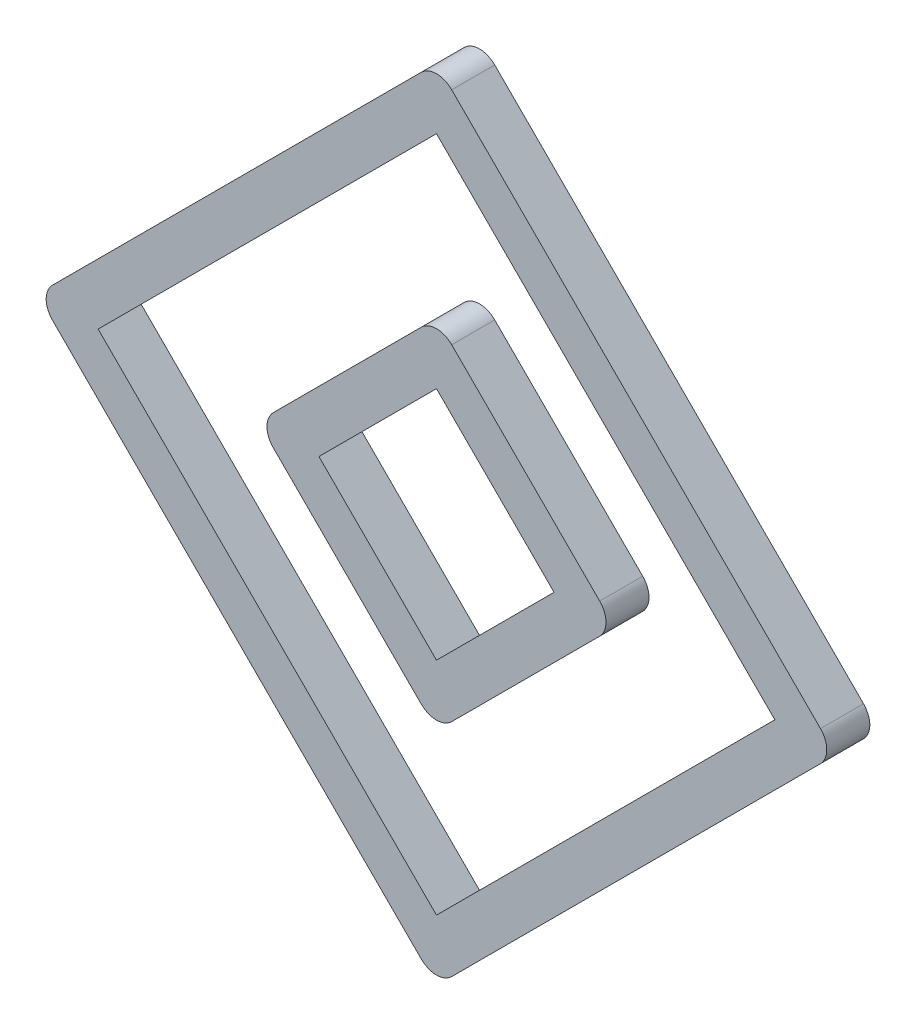
ISO-10303-21;
HEADER;
FILE_DESCRIPTION(('STEP AP214'),'2;1');
FILE_NAME('part.step','',(''),(''),'','','');
FILE_SCHEMA(('AUTOMOTIVE_DESIGN { 1 0 10303 214 1 1 1 1 }'));
ENDSEC;
DATA;
#1=APPLICATION_CONTEXT('core data for automotive mechanical design processes');
#2=APPLICATION_PROTOCOL_DEFINITION('international standard','automotive_design',2000,#1);
#3=PRODUCT_CONTEXT('',#1,'mechanical');
#4=PRODUCT('Part','Part','',(#3));
#5=PRODUCT_RELATED_PRODUCT_CATEGORY('part','',(#4));
#6=PRODUCT_DEFINITION_FORMATION('','',#4);
#7=PRODUCT_DEFINITION_CONTEXT('part definition',#1,'design');
#8=PRODUCT_DEFINITION('design','',#6,#7);
#9=PRODUCT_DEFINITION_SHAPE('','',#8);
#10=(LENGTH_UNIT() NAMED_UNIT(*) SI_UNIT(.MILLI.,.METRE.));
#11=(NAMED_UNIT(*) PLANE_ANGLE_UNIT() SI_UNIT($,.RADIAN.));
#12=(NAMED_UNIT(*) SI_UNIT($,.STERADIAN.) SOLID_ANGLE_UNIT());
#13=UNCERTAINTY_MEASURE_WITH_UNIT(LENGTH_MEASURE(1.E-05),#10,'distance_accuracy_value','');
#14=(GEOMETRIC_REPRESENTATION_CONTEXT(3) GLOBAL_UNCERTAINTY_ASSIGNED_CONTEXT((#13)) GLOBAL_UNIT_ASSIGNED_CONTEXT((#10,
#11,#12)) REPRESENTATION_CONTEXT('',''));
#15=CARTESIAN_POINT('',(0.,0.,0.));
#16=DIRECTION('',(0.,0.,1.));
#17=DIRECTION('',(1.,0.,0.));
#18=AXIS2_PLACEMENT_3D('',#15,#16,#17);
#19=CARTESIAN_POINT('',(-81.4055682835897,-81.405568283567,-46.6512806053471));
#20=DIRECTION('',(0.707106781186646,0.707106781186449,0.));
#21=DIRECTION('',(-0.707106781186449,0.707106781186646,0.));
#22=AXIS2_PLACEMENT_3D('',#19,#20,#21);
#23=PLANE('',#22);
#24=DIRECTION('',(0.,0.,1.));
#25=VECTOR('',#24,1.);
#26=CARTESIAN_POINT('',(-22.994965215639,-139.816171351534,-46.6512806053471));
#27=LINE('',#26,#25);
#28=CARTESIAN_POINT('',(-22.994965215639,-139.816171351534,-1.75000000000129));
#29=VERTEX_POINT('',#28);
#30=CARTESIAN_POINT('',(-22.994965215639,-139.816171351534,0.));
#31=VERTEX_POINT('',#30);
#32=EDGE_CURVE('E629',#29,#31,#27,.T.);
#33=ORIENTED_EDGE('',*,*,#32,.F.);
#34=DIRECTION('',(-0.707106781186449,0.707106781186646,0.));
#35=VECTOR('',#34,1.);
#36=CARTESIAN_POINT('',(-81.4055682835897,-81.405568283567,-1.75000000000129));
#37=LINE('',#36,#35);
#38=CARTESIAN_POINT('',(-27.7772722274924,-135.033864339679,-1.75000000000129));
#39=VERTEX_POINT('',#38);
#40=EDGE_CURVE('E614',#29,#39,#37,.T.);
#41=ORIENTED_EDGE('',*,*,#40,.T.);
#42=DIRECTION('',(0.,0.,1.));
#43=VECTOR('',#42,1.);
#44=CARTESIAN_POINT('',(-27.7772722274924,-135.033864339679,-46.6512806053471));
#45=LINE('',#44,#43);
#46=CARTESIAN_POINT('',(-27.7772722274924,-135.033864339679,0.));
#47=VERTEX_POINT('',#46);
#48=EDGE_CURVE('E622',#39,#47,#45,.T.);
#49=ORIENTED_EDGE('',*,*,#48,.T.);
#50=DIRECTION('',(-0.707106781186449,0.707106781186646,0.));
#51=VECTOR('',#50,1.);
#52=CARTESIAN_POINT('',(-81.4055682835897,-81.405568283567,0.));
#53=LINE('',#52,#51);
#54=EDGE_CURVE('E739',#31,#47,#53,.T.);
#55=ORIENTED_EDGE('',*,*,#54,.F.);
#56=EDGE_LOOP('',(#33,#41,#49,#55));
#57=FACE_BOUND('',#56,.T.);
#58=ADVANCED_FACE('F525',(#57),#23,.T.);
#59=CARTESIAN_POINT('',(53.6282960560882,-53.6282960560681,-46.6512806053471));
#60=DIRECTION('',(0.70710678118668,-0.707106781186415,0.));
#61=DIRECTION('',(0.707106781186415,0.70710678118668,0.));
#62=AXIS2_PLACEMENT_3D('',#59,#60,#61);
#63=PLANE('',#62);
#64=ORIENTED_EDGE('',*,*,#48,.F.);
#65=DIRECTION('',(0.707106781186415,0.70710678118668,0.));
#66=VECTOR('',#65,1.);
#67=CARTESIAN_POINT('',(53.6282960560882,-53.6282960560681,-1.75000000000129));
#68=LINE('',#67,#66);
#69=CARTESIAN_POINT('',(-22.9949652156399,-130.251557327825,-1.75000000000129));
#70=VERTEX_POINT('',#69);
#71=EDGE_CURVE('E611',#39,#70,#68,.T.);
#72=ORIENTED_EDGE('',*,*,#71,.T.);
#73=DIRECTION('',(0.,0.,1.));
#74=VECTOR('',#73,1.);
#75=CARTESIAN_POINT('',(-22.9949652156399,-130.251557327825,-46.6512806053471));
#76=LINE('',#75,#74);
#77=CARTESIAN_POINT('',(-22.9949652156399,-130.251557327825,0.));
#78=VERTEX_POINT('',#77);
#79=EDGE_CURVE('E630',#70,#78,#76,.T.);
#80=ORIENTED_EDGE('',*,*,#79,.T.);
#81=DIRECTION('',(0.707106781186415,0.70710678118668,0.));
#82=VECTOR('',#81,1.);
#83=CARTESIAN_POINT('',(53.6282960560882,-53.6282960560681,0.));
#84=LINE('',#83,#82);
#85=EDGE_CURVE('E625',#47,#78,#84,.T.);
#86=ORIENTED_EDGE('',*,*,#85,.F.);
#87=EDGE_LOOP('',(#64,#72,#80,#86));
#88=FACE_BOUND('',#87,.T.);
#89=ADVANCED_FACE('F623',(#88),#63,.T.);
#90=CARTESIAN_POINT('',(-76.6232612717329,-76.6232612717296,-46.6512806053471));
#91=DIRECTION('',(-0.707106781186562,-0.707106781186533,0.));
#92=DIRECTION('',(0.707106781186533,-0.707106781186562,0.));
#93=AXIS2_PLACEMENT_3D('',#90,#91,#92);
#94=PLANE('',#93);
#95=ORIENTED_EDGE('',*,*,#79,.F.);
#96=DIRECTION('',(0.707106781186533,-0.707106781186562,0.));
#97=VECTOR('',#96,1.);
#98=CARTESIAN_POINT('',(-76.6232612717329,-76.6232612717296,-1.75000000000129));
#99=LINE('',#98,#97);
#100=CARTESIAN_POINT('',(-18.2126582037862,-135.033864339679,-1.75000000000129));
#101=VERTEX_POINT('',#100);
#102=EDGE_CURVE('E617',#70,#101,#99,.T.);
#103=ORIENTED_EDGE('',*,*,#102,.T.);
#104=DIRECTION('',(0.,0.,1.));
#105=VECTOR('',#104,1.);
#106=CARTESIAN_POINT('',(-18.2126582037862,-135.033864339679,-46.6512806053471));
#107=LINE('',#106,#105);
#108=CARTESIAN_POINT('',(-18.2126582037862,-135.033864339679,0.));
#109=VERTEX_POINT('',#108);
#110=EDGE_CURVE('E745',#101,#109,#107,.T.);
#111=ORIENTED_EDGE('',*,*,#110,.T.);
#112=DIRECTION('',(0.707106781186533,-0.707106781186562,0.));
#113=VECTOR('',#112,1.);
#114=CARTESIAN_POINT('',(-76.6232612717329,-76.6232612717296,0.));
#115=LINE('',#114,#113);
#116=EDGE_CURVE('E731',#78,#109,#115,.T.);
#117=ORIENTED_EDGE('',*,*,#116,.F.);
#118=EDGE_LOOP('',(#95,#103,#111,#117));
#119=FACE_BOUND('',#118,.T.);
#120=ADVANCED_FACE('F679',(#119),#94,.T.);
#121=CARTESIAN_POINT('',(58.4106030679416,-58.4106030679117,-46.6512806053471));
#122=DIRECTION('',(-0.707106781186729,0.707106781186366,0.));
#123=DIRECTION('',(-0.707106781186366,-0.707106781186729,0.));
#124=AXIS2_PLACEMENT_3D('',#121,#122,#123);
#125=PLANE('',#124);
#126=ORIENTED_EDGE('',*,*,#110,.F.);
#127=DIRECTION('',(-0.707106781186366,-0.707106781186729,0.));
#128=VECTOR('',#127,1.);
#129=CARTESIAN_POINT('',(58.4106030679416,-58.4106030679117,-1.75000000000129));
#130=LINE('',#129,#128);
#131=EDGE_CURVE('E742',#101,#29,#130,.T.);
#132=ORIENTED_EDGE('',*,*,#131,.T.);
#133=ORIENTED_EDGE('',*,*,#32,.T.);
#134=DIRECTION('',(-0.707106781186366,-0.707106781186729,0.));
#135=VECTOR('',#134,1.);
#136=CARTESIAN_POINT('',(58.4106030679416,-58.4106030679117,0.));
#137=LINE('',#136,#135);
#138=EDGE_CURVE('E720',#109,#31,#137,.T.);
#139=ORIENTED_EDGE('',*,*,#138,.F.);
#140=EDGE_LOOP('',(#126,#132,#133,#139));
#141=FACE_BOUND('',#140,.T.);
#142=ADVANCED_FACE('F682',(#141),#125,.T.);
#143=CARTESIAN_POINT('',(0.,0.,0.));
#144=DIRECTION('',(0.,0.,1.));
#145=DIRECTION('',(1.,0.,0.));
#146=AXIS2_PLACEMENT_3D('',#143,#144,#145);
#147=PLANE('',#146);
#148=ORIENTED_EDGE('',*,*,#138,.T.);
#149=ORIENTED_EDGE('',*,*,#54,.T.);
#150=ORIENTED_EDGE('',*,*,#85,.T.);
#151=ORIENTED_EDGE('',*,*,#116,.T.);
#152=EDGE_LOOP('',(#148,#149,#150,#151));
#153=FACE_BOUND('',#152,.T.);
#154=DIRECTION('',(0.707106781186609,-0.707106781186487,0.));
#155=VECTOR('',#154,1.);
#156=CARTESIAN_POINT('',(-82.6430051506611,-82.6430051506753,0.));
#157=LINE('',#156,#155);
#158=CARTESIAN_POINT('',(-29.6334275281079,-135.652582773219,0.));
#159=VERTEX_POINT('',#158);
#160=CARTESIAN_POINT('',(-23.6136836491767,-141.67232665215,0.));
#161=VERTEX_POINT('',#160);
#162=EDGE_CURVE('E725',#159,#161,#157,.T.);
#163=ORIENTED_EDGE('',*,*,#162,.T.);
#164=CARTESIAN_POINT('',(-22.99496521564,-141.053608218612,0.));
#165=DIRECTION('',(0.,0.,1.));
#166=DIRECTION('',(1.,0.,0.));
#167=AXIS2_PLACEMENT_3D('',#164,#165,#166);
#168=CIRCLE('',#167,0.874999999999988);
#169=CARTESIAN_POINT('',(-22.3762467821018,-141.67232665215,0.));
#170=VERTEX_POINT('',#169);
#171=EDGE_CURVE('E727',#161,#170,#168,.T.);
#172=ORIENTED_EDGE('',*,*,#171,.T.);
#173=DIRECTION('',(0.707106781186616,0.707106781186479,0.));
#174=VECTOR('',#173,1.);
#175=CARTESIAN_POINT('',(59.6480399350262,-59.6480399350378,0.));
#176=LINE('',#175,#174);
#177=CARTESIAN_POINT('',(-16.3565029031704,-135.652582773218,0.));
#178=VERTEX_POINT('',#177);
#179=EDGE_CURVE('E734',#170,#178,#176,.T.);
#180=ORIENTED_EDGE('',*,*,#179,.T.);
#181=CARTESIAN_POINT('',(-16.9752213367092,-135.033864339679,0.));
#182=DIRECTION('',(0.,0.,1.));
#183=DIRECTION('',(1.,0.,0.));
#184=AXIS2_PLACEMENT_3D('',#181,#182,#183);
#185=CIRCLE('',#184,0.875000000000014);
#186=CARTESIAN_POINT('',(-16.356502903171,-134.415145906141,0.));
#187=VERTEX_POINT('',#186);
#188=EDGE_CURVE('E657',#178,#187,#185,.T.);
#189=ORIENTED_EDGE('',*,*,#188,.T.);
#190=DIRECTION('',(-0.707106781186531,0.707106781186564,0.));
#191=VECTOR('',#190,1.);
#192=CARTESIAN_POINT('',(-75.3858244046564,-75.3858244046529,0.));
#193=LINE('',#192,#191);
#194=CARTESIAN_POINT('',(-22.3762467821018,-128.39540202721,0.));
#195=VERTEX_POINT('',#194);
#196=EDGE_CURVE('E768',#187,#195,#193,.T.);
#197=ORIENTED_EDGE('',*,*,#196,.T.);
#198=CARTESIAN_POINT('',(-22.9949652156399,-129.014120460748,0.));
#199=DIRECTION('',(0.,0.,1.));
#200=DIRECTION('',(1.,0.,0.));
#201=AXIS2_PLACEMENT_3D('',#198,#199,#200);
#202=CIRCLE('',#201,0.87499999999962);
#203=CARTESIAN_POINT('',(-23.6136836491777,-128.39540202721,0.));
#204=VERTEX_POINT('',#203);
#205=EDGE_CURVE('E765',#195,#204,#202,.T.);
#206=ORIENTED_EDGE('',*,*,#205,.T.);
#207=DIRECTION('',(-0.707106781186474,-0.707106781186621,0.));
#208=VECTOR('',#207,1.);
#209=CARTESIAN_POINT('',(52.390859189014,-52.3908591890032,0.));
#210=LINE('',#209,#208);
#211=CARTESIAN_POINT('',(-29.6334275281072,-134.415145906141,0.));
#212=VERTEX_POINT('',#211);
#213=EDGE_CURVE('E763',#204,#212,#210,.T.);
#214=ORIENTED_EDGE('',*,*,#213,.T.);
#215=CARTESIAN_POINT('',(-29.0147090945687,-135.033864339679,0.));
#216=DIRECTION('',(0.,0.,1.));
#217=DIRECTION('',(1.,0.,0.));
#218=AXIS2_PLACEMENT_3D('',#215,#216,#217);
#219=CIRCLE('',#218,0.875000000001002);
#220=EDGE_CURVE('E730',#212,#159,#219,.T.);
#221=ORIENTED_EDGE('',*,*,#220,.T.);
#222=EDGE_LOOP('',(#163,#172,#180,#189,#197,#206,#214,#221));
#223=FACE_BOUND('',#222,.T.);
#224=ADVANCED_FACE('F690',(#153,#223),#147,.T.);
#225=CARTESIAN_POINT('',(-22.99496521564,-141.053608218612,-46.6512806053471));
#226=DIRECTION('',(0.,0.,1.));
#227=DIRECTION('',(1.,0.,0.));
#228=AXIS2_PLACEMENT_3D('',#225,#226,#227);
#229=CYLINDRICAL_SURFACE('',#228,0.874999999999988);
#230=DIRECTION('',(0.,0.,1.));
#231=VECTOR('',#230,1.);
#232=CARTESIAN_POINT('',(-23.6136836491767,-141.67232665215,-46.6512806053471));
#233=LINE('',#232,#231);
#234=CARTESIAN_POINT('',(-23.6136836491771,-141.672326652151,-1.75000000000129));
#235=VERTEX_POINT('',#234);
#236=EDGE_CURVE('E747',#235,#161,#233,.T.);
#237=ORIENTED_EDGE('',*,*,#236,.F.);
#238=CARTESIAN_POINT('',(-22.99496521564,-141.053608218612,-1.75000000000129));
#239=DIRECTION('',(0.,0.,-1.));
#240=DIRECTION('',(-1.,0.,0.));
#241=AXIS2_PLACEMENT_3D('',#238,#239,#240);
#242=CIRCLE('',#241,0.874999999999988);
#243=CARTESIAN_POINT('',(-22.3762467821018,-141.67232665215,-1.75000000000129));
#244=VERTEX_POINT('',#243);
#245=EDGE_CURVE('E540',#235,#244,#242,.F.);
#246=ORIENTED_EDGE('',*,*,#245,.T.);
#247=DIRECTION('',(0.,0.,1.));
#248=VECTOR('',#247,1.);
#249=CARTESIAN_POINT('',(-22.3762467821018,-141.67232665215,-46.6512806053471));
#250=LINE('',#249,#248);
#251=EDGE_CURVE('E661',#244,#170,#250,.T.);
#252=ORIENTED_EDGE('',*,*,#251,.T.);
#253=ORIENTED_EDGE('',*,*,#171,.F.);
#254=EDGE_LOOP('',(#237,#246,#252,#253));
#255=FACE_BOUND('',#254,.T.);
#256=ADVANCED_FACE('F687',(#255),#229,.T.);
#257=CARTESIAN_POINT('',(59.6480399350262,-59.6480399350378,-46.6512806053471));
#258=DIRECTION('',(0.707106781186479,-0.707106781186616,0.));
#259=DIRECTION('',(0.707106781186616,0.707106781186479,0.));
#260=AXIS2_PLACEMENT_3D('',#257,#258,#259);
#261=PLANE('',#260);
#262=ORIENTED_EDGE('',*,*,#251,.F.);
#263=DIRECTION('',(0.707106781186616,0.707106781186479,0.));
#264=VECTOR('',#263,1.);
#265=CARTESIAN_POINT('',(59.6480399350262,-59.6480399350378,-1.75000000000129));
#266=LINE('',#265,#264);
#267=CARTESIAN_POINT('',(-16.3565029031697,-135.652582773219,-1.75000000000129));
#268=VERTEX_POINT('',#267);
#269=EDGE_CURVE('E13',#244,#268,#266,.T.);
#270=ORIENTED_EDGE('',*,*,#269,.T.);
#271=DIRECTION('',(0.,0.,1.));
#272=VECTOR('',#271,1.);
#273=CARTESIAN_POINT('',(-16.3565029031704,-135.652582773218,-46.6512806053471));
#274=LINE('',#273,#272);
#275=EDGE_CURVE('E655',#268,#178,#274,.T.);
#276=ORIENTED_EDGE('',*,*,#275,.T.);
#277=ORIENTED_EDGE('',*,*,#179,.F.);
#278=EDGE_LOOP('',(#262,#270,#276,#277));
#279=FACE_BOUND('',#278,.T.);
#280=ADVANCED_FACE('F664',(#279),#261,.T.);
#281=CARTESIAN_POINT('',(-16.9752213367092,-135.033864339679,-46.6512806053471));
#282=DIRECTION('',(0.,0.,1.));
#283=DIRECTION('',(1.,0.,0.));
#284=AXIS2_PLACEMENT_3D('',#281,#282,#283);
#285=CYLINDRICAL_SURFACE('',#284,0.875000000000014);
#286=ORIENTED_EDGE('',*,*,#275,.F.);
#287=CARTESIAN_POINT('',(-16.9752213367092,-135.033864339679,-1.75000000000129));
#288=DIRECTION('',(0.,0.,-1.));
#289=DIRECTION('',(-1.,0.,0.));
#290=AXIS2_PLACEMENT_3D('',#287,#288,#289);
#291=CIRCLE('',#290,0.875000000000014);
#292=CARTESIAN_POINT('',(-16.356502903171,-134.415145906141,-1.75000000000129));
#293=VERTEX_POINT('',#292);
#294=EDGE_CURVE('E533',#268,#293,#291,.F.);
#295=ORIENTED_EDGE('',*,*,#294,.T.);
#296=DIRECTION('',(0.,0.,1.));
#297=VECTOR('',#296,1.);
#298=CARTESIAN_POINT('',(-16.356502903171,-134.415145906141,-46.6512806053471));
#299=LINE('',#298,#297);
#300=EDGE_CURVE('E653',#293,#187,#299,.T.);
#301=ORIENTED_EDGE('',*,*,#300,.T.);
#302=ORIENTED_EDGE('',*,*,#188,.F.);
#303=EDGE_LOOP('',(#286,#295,#301,#302));
#304=FACE_BOUND('',#303,.T.);
#305=ADVANCED_FACE('F650',(#304),#285,.T.);
#306=CARTESIAN_POINT('',(-75.3858244046564,-75.3858244046529,-46.6512806053471));
#307=DIRECTION('',(0.707106781186564,0.707106781186531,0.));
#308=DIRECTION('',(-0.707106781186531,0.707106781186564,0.));
#309=AXIS2_PLACEMENT_3D('',#306,#307,#308);
#310=PLANE('',#309);
#311=ORIENTED_EDGE('',*,*,#300,.F.);
#312=DIRECTION('',(-0.707106781186531,0.707106781186564,0.));
#313=VECTOR('',#312,1.);
#314=CARTESIAN_POINT('',(-75.3858244046564,-75.3858244046529,-1.75000000000129));
#315=LINE('',#314,#313);
#316=CARTESIAN_POINT('',(-22.3762467821017,-128.39540202721,-1.75000000000129));
#317=VERTEX_POINT('',#316);
#318=EDGE_CURVE('E647',#293,#317,#315,.T.);
#319=ORIENTED_EDGE('',*,*,#318,.T.);
#320=DIRECTION('',(0.,0.,1.));
#321=VECTOR('',#320,1.);
#322=CARTESIAN_POINT('',(-22.3762467821018,-128.39540202721,-46.6512806053471));
#323=LINE('',#322,#321);
#324=EDGE_CURVE('E754',#317,#195,#323,.T.);
#325=ORIENTED_EDGE('',*,*,#324,.T.);
#326=ORIENTED_EDGE('',*,*,#196,.F.);
#327=EDGE_LOOP('',(#311,#319,#325,#326));
#328=FACE_BOUND('',#327,.T.);
#329=ADVANCED_FACE('F696',(#328),#310,.T.);
#330=CARTESIAN_POINT('',(-22.9949652156399,-129.014120460748,-46.6512806053471));
#331=DIRECTION('',(0.,0.,1.));
#332=DIRECTION('',(1.,0.,0.));
#333=AXIS2_PLACEMENT_3D('',#330,#331,#332);
#334=CYLINDRICAL_SURFACE('',#333,0.87499999999962);
#335=ORIENTED_EDGE('',*,*,#324,.F.);
#336=CARTESIAN_POINT('',(-22.9949652156399,-129.014120460748,-1.75000000000129));
#337=DIRECTION('',(0.,0.,-1.));
#338=DIRECTION('',(-1.,0.,0.));
#339=AXIS2_PLACEMENT_3D('',#336,#337,#338);
#340=CIRCLE('',#339,0.87499999999962);
#341=CARTESIAN_POINT('',(-23.6136836491778,-128.39540202721,-1.75000000000129));
#342=VERTEX_POINT('',#341);
#343=EDGE_CURVE('E644',#317,#342,#340,.F.);
#344=ORIENTED_EDGE('',*,*,#343,.T.);
#345=DIRECTION('',(0.,0.,1.));
#346=VECTOR('',#345,1.);
#347=CARTESIAN_POINT('',(-23.6136836491777,-128.39540202721,-46.6512806053471));
#348=LINE('',#347,#346);
#349=EDGE_CURVE('E756',#342,#204,#348,.T.);
#350=ORIENTED_EDGE('',*,*,#349,.T.);
#351=ORIENTED_EDGE('',*,*,#205,.F.);
#352=EDGE_LOOP('',(#335,#344,#350,#351));
#353=FACE_BOUND('',#352,.T.);
#354=ADVANCED_FACE('F699',(#353),#334,.T.);
#355=CARTESIAN_POINT('',(52.390859189014,-52.3908591890032,-46.6512806053471));
#356=DIRECTION('',(-0.707106781186621,0.707106781186474,0.));
#357=DIRECTION('',(-0.707106781186474,-0.707106781186621,0.));
#358=AXIS2_PLACEMENT_3D('',#355,#356,#357);
#359=PLANE('',#358);
#360=ORIENTED_EDGE('',*,*,#349,.F.);
#361=DIRECTION('',(-0.707106781186474,-0.707106781186621,0.));
#362=VECTOR('',#361,1.);
#363=CARTESIAN_POINT('',(52.390859189014,-52.3908591890032,-1.75000000000129));
#364=LINE('',#363,#362);
#365=CARTESIAN_POINT('',(-29.6334275281068,-134.415145906141,-1.75000000000129));
#366=VERTEX_POINT('',#365);
#367=EDGE_CURVE('E641',#342,#366,#364,.T.);
#368=ORIENTED_EDGE('',*,*,#367,.T.);
#369=DIRECTION('',(0.,0.,1.));
#370=VECTOR('',#369,1.);
#371=CARTESIAN_POINT('',(-29.6334275281072,-134.415145906141,-46.6512806053471));
#372=LINE('',#371,#370);
#373=EDGE_CURVE('E758',#366,#212,#372,.T.);
#374=ORIENTED_EDGE('',*,*,#373,.T.);
#375=ORIENTED_EDGE('',*,*,#213,.F.);
#376=EDGE_LOOP('',(#360,#368,#374,#375));
#377=FACE_BOUND('',#376,.T.);
#378=ADVANCED_FACE('F703',(#377),#359,.T.);
#379=CARTESIAN_POINT('',(-29.0147090945687,-135.033864339679,-46.6512806053471));
#380=DIRECTION('',(0.,0.,1.));
#381=DIRECTION('',(1.,0.,0.));
#382=AXIS2_PLACEMENT_3D('',#379,#380,#381);
#383=CYLINDRICAL_SURFACE('',#382,0.875000000001002);
#384=ORIENTED_EDGE('',*,*,#373,.F.);
#385=CARTESIAN_POINT('',(-29.0147090945687,-135.033864339679,-1.75000000000129));
#386=DIRECTION('',(0.,0.,-1.));
#387=DIRECTION('',(-1.,0.,0.));
#388=AXIS2_PLACEMENT_3D('',#385,#386,#387);
#389=CIRCLE('',#388,0.875000000001002);
#390=CARTESIAN_POINT('',(-29.6334275281076,-135.652582773218,-1.75000000000129));
#391=VERTEX_POINT('',#390);
#392=EDGE_CURVE('E635',#366,#391,#389,.F.);
#393=ORIENTED_EDGE('',*,*,#392,.T.);
#394=DIRECTION('',(0.,0.,1.));
#395=VECTOR('',#394,1.);
#396=CARTESIAN_POINT('',(-29.6334275281079,-135.652582773219,-46.6512806053471));
#397=LINE('',#396,#395);
#398=EDGE_CURVE('E760',#391,#159,#397,.T.);
#399=ORIENTED_EDGE('',*,*,#398,.T.);
#400=ORIENTED_EDGE('',*,*,#220,.F.);
#401=EDGE_LOOP('',(#384,#393,#399,#400));
#402=FACE_BOUND('',#401,.T.);
#403=ADVANCED_FACE('F671',(#402),#383,.T.);
#404=CARTESIAN_POINT('',(-82.6430051506611,-82.6430051506753,-46.6512806053471));
#405=DIRECTION('',(-0.707106781186487,-0.707106781186609,0.));
#406=DIRECTION('',(0.707106781186609,-0.707106781186487,0.));
#407=AXIS2_PLACEMENT_3D('',#404,#405,#406);
#408=PLANE('',#407);
#409=ORIENTED_EDGE('',*,*,#398,.F.);
#410=DIRECTION('',(0.707106781186609,-0.707106781186487,0.));
#411=VECTOR('',#410,1.);
#412=CARTESIAN_POINT('',(-82.6430051506611,-82.6430051506753,-1.75000000000129));
#413=LINE('',#412,#411);
#414=EDGE_CURVE('E633',#391,#235,#413,.T.);
#415=ORIENTED_EDGE('',*,*,#414,.T.);
#416=ORIENTED_EDGE('',*,*,#236,.T.);
#417=ORIENTED_EDGE('',*,*,#162,.F.);
#418=EDGE_LOOP('',(#409,#415,#416,#417));
#419=FACE_BOUND('',#418,.T.);
#420=ADVANCED_FACE('F667',(#419),#408,.T.);
#421=CARTESIAN_POINT('',(-22.994965215639,-120.03386433968,-1.75000000000129));
#422=DIRECTION('',(0.,0.,-1.));
#423=DIRECTION('',(0.,1.,0.));
#424=AXIS2_PLACEMENT_3D('',#421,#422,#423);
#425=PLANE('',#424);
#426=ORIENTED_EDGE('',*,*,#131,.F.);
#427=ORIENTED_EDGE('',*,*,#102,.F.);
#428=ORIENTED_EDGE('',*,*,#71,.F.);
#429=ORIENTED_EDGE('',*,*,#40,.F.);
#430=EDGE_LOOP('',(#426,#427,#428,#429));
#431=FACE_BOUND('',#430,.T.);
#432=ORIENTED_EDGE('',*,*,#414,.F.);
#433=ORIENTED_EDGE('',*,*,#392,.F.);
#434=ORIENTED_EDGE('',*,*,#367,.F.);
#435=ORIENTED_EDGE('',*,*,#343,.F.);
#436=ORIENTED_EDGE('',*,*,#318,.F.);
#437=ORIENTED_EDGE('',*,*,#294,.F.);
#438=ORIENTED_EDGE('',*,*,#269,.F.);
#439=ORIENTED_EDGE('',*,*,#245,.F.);
#440=EDGE_LOOP('',(#432,#433,#434,#435,#436,#437,#438,#439));
#441=FACE_BOUND('',#440,.T.);
#442=ADVANCED_FACE('F527',(#431,#441),#425,.T.);
#443=CLOSED_SHELL('',(#58,#89,#120,#142,#224,#256,#280,#305,#329,#354,#378,#403,#420,#442));
#444=MANIFOLD_SOLID_BREP('B2',#443);
#445=CARTESIAN_POINT('',(-22.994965215639,-120.03386433968,-1.75000000000129));
#446=DIRECTION('',(0.,0.,-1.));
#447=DIRECTION('',(0.,1.,0.));
#448=AXIS2_PLACEMENT_3D('',#445,#446,#447);
#449=PLANE('',#448);
#450=CARTESIAN_POINT('',(-22.994965215639,-120.03386433968,-1.75000000000129));
#451=DIRECTION('',(0.,0.,-1.));
#452=DIRECTION('',(-1.,0.,0.));
#453=AXIS2_PLACEMENT_3D('',#450,#451,#452);
#454=CIRCLE('',#453,0.874999999999989);
#455=CARTESIAN_POINT('',(-22.3762467821007,-119.415145906141,-1.75000000000129));
#456=VERTEX_POINT('',#455);
#457=CARTESIAN_POINT('',(-23.6136836491772,-119.415145906141,-1.75000000000129));
#458=VERTEX_POINT('',#457);
#459=EDGE_CURVE('E911',#456,#458,#454,.F.);
#460=ORIENTED_EDGE('',*,*,#459,.F.);
#461=DIRECTION('',(-0.707106781186528,0.707106781186567,0.));
#462=VECTOR('',#461,1.);
#463=CARTESIAN_POINT('',(-70.8956963441217,-70.8956963441178,-1.75000000000129));
#464=LINE('',#463,#462);
#465=CARTESIAN_POINT('',(-7.37624678210107,-134.415145906142,-1.75000000000129));
#466=VERTEX_POINT('',#465);
#467=EDGE_CURVE('E1068',#466,#456,#464,.T.);
#468=ORIENTED_EDGE('',*,*,#467,.F.);
#469=CARTESIAN_POINT('',(-7.99496521563933,-135.03386433968,-1.75000000000129));
#470=DIRECTION('',(0.,0.,-1.));
#471=DIRECTION('',(-1.,0.,0.));
#472=AXIS2_PLACEMENT_3D('',#469,#470,#471);
#473=CIRCLE('',#472,0.874999999999981);
#474=CARTESIAN_POINT('',(-7.37624678210109,-135.652582773218,-1.75000000000129));
#475=VERTEX_POINT('',#474);
#476=EDGE_CURVE('E1065',#475,#466,#473,.F.);
#477=ORIENTED_EDGE('',*,*,#476,.F.);
#478=DIRECTION('',(0.70710678118653,0.707106781186565,0.));
#479=VECTOR('',#478,1.);
#480=CARTESIAN_POINT('',(64.1381679955584,-64.1381679955552,-1.75000000000129));
#481=LINE('',#480,#479);
#482=CARTESIAN_POINT('',(-22.3762467821007,-150.652582773219,-1.75000000000129));
#483=VERTEX_POINT('',#482);
#484=EDGE_CURVE('E1058',#483,#475,#481,.T.);
#485=ORIENTED_EDGE('',*,*,#484,.F.);
#486=CARTESIAN_POINT('',(-22.994965215639,-150.03386433968,-1.75000000000129));
#487=DIRECTION('',(0.,0.,-1.));
#488=DIRECTION('',(-1.,0.,0.));
#489=AXIS2_PLACEMENT_3D('',#486,#487,#488);
#490=CIRCLE('',#489,0.874999999999989);
#491=CARTESIAN_POINT('',(-23.6136836491772,-150.652582773219,-1.75000000000129));
#492=VERTEX_POINT('',#491);
#493=EDGE_CURVE('E1035',#492,#483,#490,.F.);
#494=ORIENTED_EDGE('',*,*,#493,.F.);
#495=DIRECTION('',(0.70710678118653,-0.707106781186565,0.));
#496=VECTOR('',#495,1.);
#497=CARTESIAN_POINT('',(-87.1331332111985,-87.1331332111941,-1.75000000000129));
#498=LINE('',#497,#496);
#499=CARTESIAN_POINT('',(-38.6136836491769,-135.652582773218,-1.75000000000129));
#500=VERTEX_POINT('',#499);
#501=EDGE_CURVE('E896',#500,#492,#498,.T.);
#502=ORIENTED_EDGE('',*,*,#501,.F.);
#503=CARTESIAN_POINT('',(-37.9949652156386,-135.03386433968,-1.75000000000129));
#504=DIRECTION('',(0.,0.,-1.));
#505=DIRECTION('',(-1.,0.,0.));
#506=AXIS2_PLACEMENT_3D('',#503,#504,#505);
#507=CIRCLE('',#506,0.874999999999997);
#508=CARTESIAN_POINT('',(-38.6136836491769,-134.415145906142,-1.75000000000129));
#509=VERTEX_POINT('',#508);
#510=EDGE_CURVE('E1074',#509,#500,#507,.F.);
#511=ORIENTED_EDGE('',*,*,#510,.F.);
#512=DIRECTION('',(-0.707106781186528,-0.707106781186567,0.));
#513=VECTOR('',#512,1.);
#514=CARTESIAN_POINT('',(47.9007311284814,-47.9007311284788,-1.75000000000129));
#515=LINE('',#514,#513);
#516=EDGE_CURVE('E1072',#458,#509,#515,.T.);
#517=ORIENTED_EDGE('',*,*,#516,.F.);
#518=EDGE_LOOP('',(#460,#468,#477,#485,#494,#502,#511,#517));
#519=FACE_BOUND('',#518,.T.);
#520=DIRECTION('',(0.70710678118653,-0.707106781186565,0.));
#521=VECTOR('',#520,1.);
#522=CARTESIAN_POINT('',(-72.1331332111981,-72.1331332111945,-1.75000000000129));
#523=LINE('',#522,#521);
#524=CARTESIAN_POINT('',(-22.994965215639,-121.271301206756,-1.75000000000129));
#525=VERTEX_POINT('',#524);
#526=CARTESIAN_POINT('',(-9.23240208271574,-135.03386433968,-1.75000000000129));
#527=VERTEX_POINT('',#526);
#528=EDGE_CURVE('E902',#525,#527,#523,.T.);
#529=ORIENTED_EDGE('',*,*,#528,.F.);
#530=DIRECTION('',(0.707106781186529,0.707106781186566,0.));
#531=VECTOR('',#530,1.);
#532=CARTESIAN_POINT('',(49.1381679955579,-49.1381679955554,-1.75000000000129));
#533=LINE('',#532,#531);
#534=CARTESIAN_POINT('',(-36.7575283485622,-135.03386433968,-1.75000000000129));
#535=VERTEX_POINT('',#534);
#536=EDGE_CURVE('E1059',#535,#525,#533,.T.);
#537=ORIENTED_EDGE('',*,*,#536,.F.);
#538=DIRECTION('',(-0.707106781186531,0.707106781186564,0.));
#539=VECTOR('',#538,1.);
#540=CARTESIAN_POINT('',(-85.895696344122,-85.8956963441179,-1.75000000000129));
#541=LINE('',#540,#539);
#542=CARTESIAN_POINT('',(-22.994965215639,-148.796427472604,-1.75000000000129));
#543=VERTEX_POINT('',#542);
#544=EDGE_CURVE('E938',#543,#535,#541,.T.);
#545=ORIENTED_EDGE('',*,*,#544,.F.);
#546=DIRECTION('',(-0.707106781186529,-0.707106781186566,0.));
#547=VECTOR('',#546,1.);
#548=CARTESIAN_POINT('',(62.9007311284819,-62.9007311284786,-1.75000000000129));
#549=LINE('',#548,#547);
#550=EDGE_CURVE('E523',#527,#543,#549,.T.);
#551=ORIENTED_EDGE('',*,*,#550,.F.);
#552=EDGE_LOOP('',(#529,#537,#545,#551));
#553=FACE_BOUND('',#552,.T.);
#554=ADVANCED_FACE('F892',(#519,#553),#449,.T.);
#555=CARTESIAN_POINT('',(-70.8956963441217,-70.8956963441178,-46.6512806053471));
#556=DIRECTION('',(0.707106781186567,0.707106781186528,0.));
#557=DIRECTION('',(-0.707106781186528,0.707106781186567,0.));
#558=AXIS2_PLACEMENT_3D('',#555,#556,#557);
#559=PLANE('',#558);
#560=DIRECTION('',(0.,0.,1.));
#561=VECTOR('',#560,1.);
#562=CARTESIAN_POINT('',(-7.3762467821011,-134.415145906142,-46.6512806053471));
#563=LINE('',#562,#561);
#564=CARTESIAN_POINT('',(-7.3762467821011,-134.415145906142,0.));
#565=VERTEX_POINT('',#564);
#566=EDGE_CURVE('E1042',#466,#565,#563,.T.);
#567=ORIENTED_EDGE('',*,*,#566,.F.);
#568=ORIENTED_EDGE('',*,*,#467,.T.);
#569=DIRECTION('',(0.,0.,1.));
#570=VECTOR('',#569,1.);
#571=CARTESIAN_POINT('',(-22.3762467821007,-119.415145906141,-46.6512806053471));
#572=LINE('',#571,#570);
#573=CARTESIAN_POINT('',(-22.3762467821007,-119.415145906141,0.));
#574=VERTEX_POINT('',#573);
#575=EDGE_CURVE('E1040',#456,#574,#572,.T.);
#576=ORIENTED_EDGE('',*,*,#575,.T.);
#577=DIRECTION('',(-0.707106781186528,0.707106781186567,0.));
#578=VECTOR('',#577,1.);
#579=CARTESIAN_POINT('',(-70.8956963441217,-70.8956963441178,0.));
#580=LINE('',#579,#578);
#581=EDGE_CURVE('E1022',#565,#574,#580,.T.);
#582=ORIENTED_EDGE('',*,*,#581,.F.);
#583=EDGE_LOOP('',(#567,#568,#576,#582));
#584=FACE_BOUND('',#583,.T.);
#585=ADVANCED_FACE('F1097',(#584),#559,.T.);
#586=CARTESIAN_POINT('',(-72.1331332111981,-72.1331332111945,-46.6512806053471));
#587=DIRECTION('',(-0.707106781186565,-0.70710678118653,0.));
#588=DIRECTION('',(0.70710678118653,-0.707106781186565,0.));
#589=AXIS2_PLACEMENT_3D('',#586,#587,#588);
#590=PLANE('',#589);
#591=DIRECTION('',(0.,0.,1.));
#592=VECTOR('',#591,1.);
#593=CARTESIAN_POINT('',(-22.994965215639,-121.271301206756,-46.6512806053471));
#594=LINE('',#593,#592);
#595=CARTESIAN_POINT('',(-22.994965215639,-121.271301206756,0.));
#596=VERTEX_POINT('',#595);
#597=EDGE_CURVE('E1052',#525,#596,#594,.T.);
#598=ORIENTED_EDGE('',*,*,#597,.F.);
#599=ORIENTED_EDGE('',*,*,#528,.T.);
#600=DIRECTION('',(0.,0.,1.));
#601=VECTOR('',#600,1.);
#602=CARTESIAN_POINT('',(-9.23240208271574,-135.03386433968,-46.6512806053471));
#603=LINE('',#602,#601);
#604=CARTESIAN_POINT('',(-9.23240208271574,-135.03386433968,0.));
#605=VERTEX_POINT('',#604);
#606=EDGE_CURVE('E1050',#527,#605,#603,.T.);
#607=ORIENTED_EDGE('',*,*,#606,.T.);
#608=DIRECTION('',(0.70710678118653,-0.707106781186565,0.));
#609=VECTOR('',#608,1.);
#610=CARTESIAN_POINT('',(-72.1331332111981,-72.1331332111945,0.));
#611=LINE('',#610,#609);
#612=EDGE_CURVE('E1005',#596,#605,#611,.T.);
#613=ORIENTED_EDGE('',*,*,#612,.F.);
#614=EDGE_LOOP('',(#598,#599,#607,#613));
#615=FACE_BOUND('',#614,.T.);
#616=ADVANCED_FACE('F1102',(#615),#590,.T.);
#617=CARTESIAN_POINT('',(-22.994965215639,-120.03386433968,-46.6512806053471));
#618=DIRECTION('',(0.,0.,1.));
#619=DIRECTION('',(1.,0.,0.));
#620=AXIS2_PLACEMENT_3D('',#617,#618,#619);
#621=CYLINDRICAL_SURFACE('',#620,0.874999999999989);
#622=ORIENTED_EDGE('',*,*,#575,.F.);
#623=ORIENTED_EDGE('',*,*,#459,.T.);
#624=DIRECTION('',(0.,0.,1.));
#625=VECTOR('',#624,1.);
#626=CARTESIAN_POINT('',(-23.6136836491772,-119.415145906141,-46.6512806053471));
#627=LINE('',#626,#625);
#628=CARTESIAN_POINT('',(-23.6136836491772,-119.415145906141,0.));
#629=VERTEX_POINT('',#628);
#630=EDGE_CURVE('E1038',#458,#629,#627,.T.);
#631=ORIENTED_EDGE('',*,*,#630,.T.);
#632=CARTESIAN_POINT('',(-22.994965215639,-120.03386433968,0.));
#633=DIRECTION('',(0.,0.,1.));
#634=DIRECTION('',(1.,0.,0.));
#635=AXIS2_PLACEMENT_3D('',#632,#633,#634);
#636=CIRCLE('',#635,0.874999999999989);
#637=EDGE_CURVE('E1025',#574,#629,#636,.T.);
#638=ORIENTED_EDGE('',*,*,#637,.F.);
#639=EDGE_LOOP('',(#622,#623,#631,#638));
#640=FACE_BOUND('',#639,.T.);
#641=ADVANCED_FACE('F1108',(#640),#621,.T.);
#642=CARTESIAN_POINT('',(-87.1331332111985,-87.1331332111941,-46.6512806053471));
#643=DIRECTION('',(-0.707106781186565,-0.70710678118653,0.));
#644=DIRECTION('',(0.70710678118653,-0.707106781186565,0.));
#645=AXIS2_PLACEMENT_3D('',#642,#643,#644);
#646=PLANE('',#645);
#647=DIRECTION('',(0.,0.,1.));
#648=VECTOR('',#647,1.);
#649=CARTESIAN_POINT('',(-38.6136836491769,-135.652582773218,-46.6512806053471));
#650=LINE('',#649,#648);
#651=CARTESIAN_POINT('',(-38.6136836491769,-135.652582773218,0.));
#652=VERTEX_POINT('',#651);
#653=EDGE_CURVE('E1033',#500,#652,#650,.T.);
#654=ORIENTED_EDGE('',*,*,#653,.F.);
#655=ORIENTED_EDGE('',*,*,#501,.T.);
#656=DIRECTION('',(0.,0.,1.));
#657=VECTOR('',#656,1.);
#658=CARTESIAN_POINT('',(-23.6136836491772,-150.652582773219,-46.6512806053471));
#659=LINE('',#658,#657);
#660=CARTESIAN_POINT('',(-23.6136836491772,-150.652582773219,0.));
#661=VERTEX_POINT('',#660);
#662=EDGE_CURVE('E1048',#492,#661,#659,.T.);
#663=ORIENTED_EDGE('',*,*,#662,.T.);
#664=DIRECTION('',(0.70710678118653,-0.707106781186565,0.));
#665=VECTOR('',#664,1.);
#666=CARTESIAN_POINT('',(-87.1331332111985,-87.1331332111941,0.));
#667=LINE('',#666,#665);
#668=EDGE_CURVE('E1010',#652,#661,#667,.T.);
#669=ORIENTED_EDGE('',*,*,#668,.F.);
#670=EDGE_LOOP('',(#654,#655,#663,#669));
#671=FACE_BOUND('',#670,.T.);
#672=ADVANCED_FACE('F1082',(#671),#646,.T.);
#673=CARTESIAN_POINT('',(-85.895696344122,-85.8956963441179,-46.6512806053471));
#674=DIRECTION('',(0.707106781186564,0.707106781186531,0.));
#675=DIRECTION('',(-0.707106781186531,0.707106781186564,0.));
#676=AXIS2_PLACEMENT_3D('',#673,#674,#675);
#677=PLANE('',#676);
#678=DIRECTION('',(0.,0.,1.));
#679=VECTOR('',#678,1.);
#680=CARTESIAN_POINT('',(-22.994965215639,-148.796427472604,-46.6512806053471));
#681=LINE('',#680,#679);
#682=CARTESIAN_POINT('',(-22.994965215639,-148.796427472604,0.));
#683=VERTEX_POINT('',#682);
#684=EDGE_CURVE('E985',#543,#683,#681,.T.);
#685=ORIENTED_EDGE('',*,*,#684,.F.);
#686=ORIENTED_EDGE('',*,*,#544,.T.);
#687=DIRECTION('',(0.,0.,1.));
#688=VECTOR('',#687,1.);
#689=CARTESIAN_POINT('',(-36.7575283485622,-135.03386433968,-46.6512806053471));
#690=LINE('',#689,#688);
#691=CARTESIAN_POINT('',(-36.7575283485622,-135.03386433968,0.));
#692=VERTEX_POINT('',#691);
#693=EDGE_CURVE('E991',#535,#692,#690,.T.);
#694=ORIENTED_EDGE('',*,*,#693,.T.);
#695=DIRECTION('',(-0.707106781186531,0.707106781186564,0.));
#696=VECTOR('',#695,1.);
#697=CARTESIAN_POINT('',(-85.895696344122,-85.8956963441179,0.));
#698=LINE('',#697,#696);
#699=EDGE_CURVE('E995',#683,#692,#698,.T.);
#700=ORIENTED_EDGE('',*,*,#699,.F.);
#701=EDGE_LOOP('',(#685,#686,#694,#700));
#702=FACE_BOUND('',#701,.T.);
#703=ADVANCED_FACE('F996',(#702),#677,.T.);
#704=CARTESIAN_POINT('',(-37.9949652156386,-135.03386433968,-46.6512806053471));
#705=DIRECTION('',(0.,0.,1.));
#706=DIRECTION('',(1.,0.,0.));
#707=AXIS2_PLACEMENT_3D('',#704,#705,#706);
#708=CYLINDRICAL_SURFACE('',#707,0.874999999999997);
#709=DIRECTION('',(0.,0.,1.));
#710=VECTOR('',#709,1.);
#711=CARTESIAN_POINT('',(-38.6136836491769,-134.415145906142,-46.6512806053471));
#712=LINE('',#711,#710);
#713=CARTESIAN_POINT('',(-38.6136836491769,-134.415145906142,0.));
#714=VERTEX_POINT('',#713);
#715=EDGE_CURVE('E1036',#509,#714,#712,.T.);
#716=ORIENTED_EDGE('',*,*,#715,.F.);
#717=ORIENTED_EDGE('',*,*,#510,.T.);
#718=ORIENTED_EDGE('',*,*,#653,.T.);
#719=CARTESIAN_POINT('',(-37.9949652156386,-135.03386433968,0.));
#720=DIRECTION('',(0.,0.,1.));
#721=DIRECTION('',(1.,0.,0.));
#722=AXIS2_PLACEMENT_3D('',#719,#720,#721);
#723=CIRCLE('',#722,0.874999999999997);
#724=EDGE_CURVE('E992',#714,#652,#723,.T.);
#725=ORIENTED_EDGE('',*,*,#724,.F.);
#726=EDGE_LOOP('',(#716,#717,#718,#725));
#727=FACE_BOUND('',#726,.T.);
#728=ADVANCED_FACE('F1092',(#727),#708,.T.);
#729=CARTESIAN_POINT('',(49.1381679955579,-49.1381679955554,-46.6512806053471));
#730=DIRECTION('',(0.707106781186566,-0.707106781186529,0.));
#731=DIRECTION('',(0.707106781186529,0.707106781186566,0.));
#732=AXIS2_PLACEMENT_3D('',#729,#730,#731);
#733=PLANE('',#732);
#734=ORIENTED_EDGE('',*,*,#693,.F.);
#735=ORIENTED_EDGE('',*,*,#536,.T.);
#736=ORIENTED_EDGE('',*,*,#597,.T.);
#737=DIRECTION('',(0.707106781186529,0.707106781186566,0.));
#738=VECTOR('',#737,1.);
#739=CARTESIAN_POINT('',(49.1381679955579,-49.1381679955554,0.));
#740=LINE('',#739,#738);
#741=EDGE_CURVE('E1001',#692,#596,#740,.T.);
#742=ORIENTED_EDGE('',*,*,#741,.F.);
#743=EDGE_LOOP('',(#734,#735,#736,#742));
#744=FACE_BOUND('',#743,.T.);
#745=ADVANCED_FACE('F1121',(#744),#733,.T.);
#746=CARTESIAN_POINT('',(47.9007311284814,-47.9007311284788,-46.6512806053471));
#747=DIRECTION('',(-0.707106781186567,0.707106781186528,0.));
#748=DIRECTION('',(-0.707106781186528,-0.707106781186567,0.));
#749=AXIS2_PLACEMENT_3D('',#746,#747,#748);
#750=PLANE('',#749);
#751=ORIENTED_EDGE('',*,*,#630,.F.);
#752=ORIENTED_EDGE('',*,*,#516,.T.);
#753=ORIENTED_EDGE('',*,*,#715,.T.);
#754=DIRECTION('',(-0.707106781186528,-0.707106781186567,0.));
#755=VECTOR('',#754,1.);
#756=CARTESIAN_POINT('',(47.9007311284814,-47.9007311284788,0.));
#757=LINE('',#756,#755);
#758=EDGE_CURVE('E1028',#629,#714,#757,.T.);
#759=ORIENTED_EDGE('',*,*,#758,.F.);
#760=EDGE_LOOP('',(#751,#752,#753,#759));
#761=FACE_BOUND('',#760,.T.);
#762=ADVANCED_FACE('F1095',(#761),#750,.T.);
#763=CARTESIAN_POINT('',(64.1381679955584,-64.1381679955552,-46.6512806053471));
#764=DIRECTION('',(0.707106781186565,-0.70710678118653,0.));
#765=DIRECTION('',(0.70710678118653,0.707106781186565,0.));
#766=AXIS2_PLACEMENT_3D('',#763,#764,#765);
#767=PLANE('',#766);
#768=DIRECTION('',(0.,0.,1.));
#769=VECTOR('',#768,1.);
#770=CARTESIAN_POINT('',(-22.3762467821007,-150.652582773219,-46.6512806053471));
#771=LINE('',#770,#769);
#772=CARTESIAN_POINT('',(-22.3762467821007,-150.652582773219,0.));
#773=VERTEX_POINT('',#772);
#774=EDGE_CURVE('E1046',#483,#773,#771,.T.);
#775=ORIENTED_EDGE('',*,*,#774,.F.);
#776=ORIENTED_EDGE('',*,*,#484,.T.);
#777=DIRECTION('',(0.,0.,1.));
#778=VECTOR('',#777,1.);
#779=CARTESIAN_POINT('',(-7.37624678210106,-135.652582773218,-46.6512806053471));
#780=LINE('',#779,#778);
#781=CARTESIAN_POINT('',(-7.37624678210106,-135.652582773218,0.));
#782=VERTEX_POINT('',#781);
#783=EDGE_CURVE('E1044',#475,#782,#780,.T.);
#784=ORIENTED_EDGE('',*,*,#783,.T.);
#785=DIRECTION('',(0.70710678118653,0.707106781186565,0.));
#786=VECTOR('',#785,1.);
#787=CARTESIAN_POINT('',(64.1381679955584,-64.1381679955552,0.));
#788=LINE('',#787,#786);
#789=EDGE_CURVE('E1016',#773,#782,#788,.T.);
#790=ORIENTED_EDGE('',*,*,#789,.F.);
#791=EDGE_LOOP('',(#775,#776,#784,#790));
#792=FACE_BOUND('',#791,.T.);
#793=ADVANCED_FACE('F1128',(#792),#767,.T.);
#794=CARTESIAN_POINT('',(62.9007311284819,-62.9007311284786,-46.6512806053471));
#795=DIRECTION('',(-0.707106781186566,0.707106781186529,0.));
#796=DIRECTION('',(-0.707106781186529,-0.707106781186566,0.));
#797=AXIS2_PLACEMENT_3D('',#794,#795,#796);
#798=PLANE('',#797);
#799=ORIENTED_EDGE('',*,*,#606,.F.);
#800=ORIENTED_EDGE('',*,*,#550,.T.);
#801=ORIENTED_EDGE('',*,*,#684,.T.);
#802=DIRECTION('',(-0.707106781186529,-0.707106781186566,0.));
#803=VECTOR('',#802,1.);
#804=CARTESIAN_POINT('',(62.9007311284819,-62.9007311284786,0.));
#805=LINE('',#804,#803);
#806=EDGE_CURVE('E988',#605,#683,#805,.T.);
#807=ORIENTED_EDGE('',*,*,#806,.F.);
#808=EDGE_LOOP('',(#799,#800,#801,#807));
#809=FACE_BOUND('',#808,.T.);
#810=ADVANCED_FACE('F894',(#809),#798,.T.);
#811=CARTESIAN_POINT('',(-22.994965215639,-150.03386433968,-46.6512806053471));
#812=DIRECTION('',(0.,0.,1.));
#813=DIRECTION('',(1.,0.,0.));
#814=AXIS2_PLACEMENT_3D('',#811,#812,#813);
#815=CYLINDRICAL_SURFACE('',#814,0.874999999999989);
#816=ORIENTED_EDGE('',*,*,#662,.F.);
#817=ORIENTED_EDGE('',*,*,#493,.T.);
#818=ORIENTED_EDGE('',*,*,#774,.T.);
#819=CARTESIAN_POINT('',(-22.994965215639,-150.03386433968,0.));
#820=DIRECTION('',(0.,0.,1.));
#821=DIRECTION('',(1.,0.,0.));
#822=AXIS2_PLACEMENT_3D('',#819,#820,#821);
#823=CIRCLE('',#822,0.874999999999989);
#824=EDGE_CURVE('E1013',#661,#773,#823,.T.);
#825=ORIENTED_EDGE('',*,*,#824,.F.);
#826=EDGE_LOOP('',(#816,#817,#818,#825));
#827=FACE_BOUND('',#826,.T.);
#828=ADVANCED_FACE('F1086',(#827),#815,.T.);
#829=CARTESIAN_POINT('',(-7.99496521563933,-135.03386433968,-46.6512806053471));
#830=DIRECTION('',(0.,0.,1.));
#831=DIRECTION('',(1.,0.,0.));
#832=AXIS2_PLACEMENT_3D('',#829,#830,#831);
#833=CYLINDRICAL_SURFACE('',#832,0.874999999999981);
#834=ORIENTED_EDGE('',*,*,#783,.F.);
#835=ORIENTED_EDGE('',*,*,#476,.T.);
#836=ORIENTED_EDGE('',*,*,#566,.T.);
#837=CARTESIAN_POINT('',(-7.99496521563933,-135.03386433968,0.));
#838=DIRECTION('',(0.,0.,1.));
#839=DIRECTION('',(1.,0.,0.));
#840=AXIS2_PLACEMENT_3D('',#837,#838,#839);
#841=CIRCLE('',#840,0.874999999999981);
#842=EDGE_CURVE('E1019',#782,#565,#841,.T.);
#843=ORIENTED_EDGE('',*,*,#842,.F.);
#844=EDGE_LOOP('',(#834,#835,#836,#843));
#845=FACE_BOUND('',#844,.T.);
#846=ADVANCED_FACE('F1134',(#845),#833,.T.);
#847=CARTESIAN_POINT('',(0.,0.,0.));
#848=DIRECTION('',(0.,0.,1.));
#849=DIRECTION('',(1.,0.,0.));
#850=AXIS2_PLACEMENT_3D('',#847,#848,#849);
#851=PLANE('',#850);
#852=ORIENTED_EDGE('',*,*,#581,.T.);
#853=ORIENTED_EDGE('',*,*,#637,.T.);
#854=ORIENTED_EDGE('',*,*,#758,.T.);
#855=ORIENTED_EDGE('',*,*,#724,.T.);
#856=ORIENTED_EDGE('',*,*,#668,.T.);
#857=ORIENTED_EDGE('',*,*,#824,.T.);
#858=ORIENTED_EDGE('',*,*,#789,.T.);
#859=ORIENTED_EDGE('',*,*,#842,.T.);
#860=EDGE_LOOP('',(#852,#853,#854,#855,#856,#857,#858,#859));
#861=FACE_BOUND('',#860,.T.);
#862=ORIENTED_EDGE('',*,*,#741,.T.);
#863=ORIENTED_EDGE('',*,*,#612,.T.);
#864=ORIENTED_EDGE('',*,*,#806,.T.);
#865=ORIENTED_EDGE('',*,*,#699,.T.);
#866=EDGE_LOOP('',(#862,#863,#864,#865));
#867=FACE_BOUND('',#866,.T.);
#868=ADVANCED_FACE('F1003',(#861,#867),#851,.T.);
#869=CLOSED_SHELL('',(#554,#585,#616,#641,#672,#703,#728,#745,#762,#793,#810,#828,#846,#868));
#870=MANIFOLD_SOLID_BREP('B7',#869);
#871=ADVANCED_BREP_SHAPE_REPRESENTATION('',(#18,#444,#870),#14);
#872=SHAPE_DEFINITION_REPRESENTATION(#9,#871);
ENDSEC;
END-ISO-10303-21;
